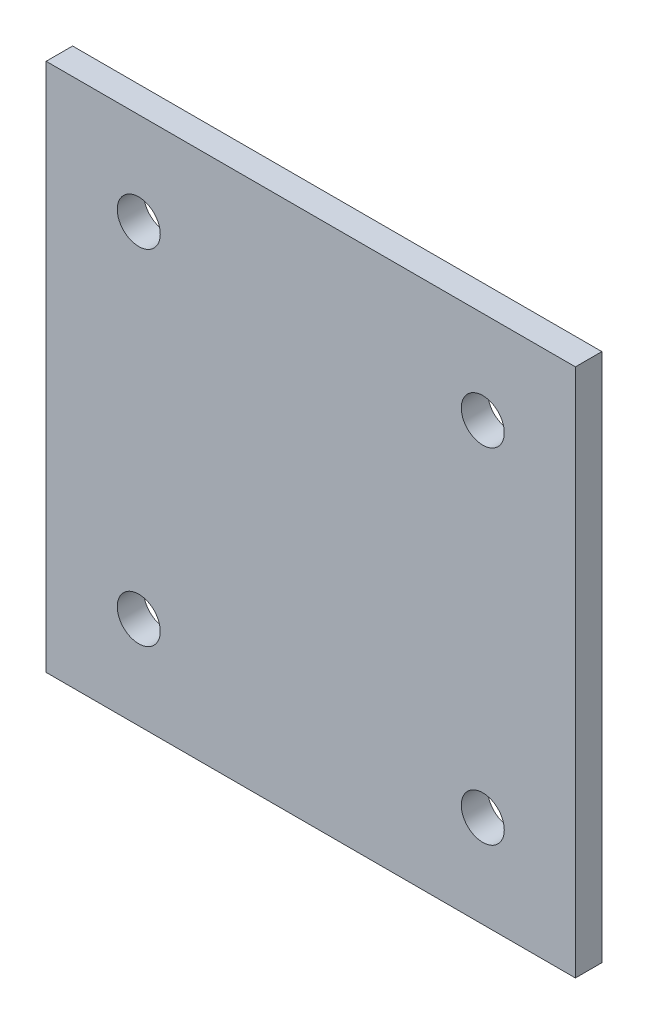
ISO-10303-21;
HEADER;
FILE_DESCRIPTION(('STEP AP214'),'2;1');
FILE_NAME('part.step','',(''),(''),'','','');
FILE_SCHEMA(('AUTOMOTIVE_DESIGN { 1 0 10303 214 1 1 1 1 }'));
ENDSEC;
DATA;
#1=APPLICATION_CONTEXT('core data for automotive mechanical design processes');
#2=APPLICATION_PROTOCOL_DEFINITION('international standard','automotive_design',2000,#1);
#3=PRODUCT_CONTEXT('',#1,'mechanical');
#4=PRODUCT('Part','Part','',(#3));
#5=PRODUCT_RELATED_PRODUCT_CATEGORY('part','',(#4));
#6=PRODUCT_DEFINITION_FORMATION('','',#4);
#7=PRODUCT_DEFINITION_CONTEXT('part definition',#1,'design');
#8=PRODUCT_DEFINITION('design','',#6,#7);
#9=PRODUCT_DEFINITION_SHAPE('','',#8);
#10=(LENGTH_UNIT() NAMED_UNIT(*) SI_UNIT(.MILLI.,.METRE.));
#11=(NAMED_UNIT(*) PLANE_ANGLE_UNIT() SI_UNIT($,.RADIAN.));
#12=(NAMED_UNIT(*) SI_UNIT($,.STERADIAN.) SOLID_ANGLE_UNIT());
#13=UNCERTAINTY_MEASURE_WITH_UNIT(LENGTH_MEASURE(1.E-05),#10,'distance_accuracy_value','');
#14=(GEOMETRIC_REPRESENTATION_CONTEXT(3) GLOBAL_UNCERTAINTY_ASSIGNED_CONTEXT((#13)) GLOBAL_UNIT_ASSIGNED_CONTEXT((#10,
#11,#12)) REPRESENTATION_CONTEXT('',''));
#15=CARTESIAN_POINT('',(0.,0.,0.));
#16=DIRECTION('',(0.,0.,1.));
#17=DIRECTION('',(1.,0.,0.));
#18=AXIS2_PLACEMENT_3D('',#15,#16,#17);
#19=CARTESIAN_POINT('',(0.,0.,2.));
#20=DIRECTION('',(0.,0.,-1.));
#21=DIRECTION('',(-1.,0.,0.));
#22=AXIS2_PLACEMENT_3D('',#19,#20,#21);
#23=PLANE('',#22);
#24=DIRECTION('',(0.,1.,0.));
#25=VECTOR('',#24,1.);
#26=CARTESIAN_POINT('',(20.,-20.,2.));
#27=LINE('',#26,#25);
#28=CARTESIAN_POINT('',(20.,-20.,2.));
#29=VERTEX_POINT('',#28);
#30=CARTESIAN_POINT('',(20.,20.,2.));
#31=VERTEX_POINT('',#30);
#32=EDGE_CURVE('E98',#29,#31,#27,.T.);
#33=ORIENTED_EDGE('',*,*,#32,.T.);
#34=DIRECTION('',(-1.,0.,0.));
#35=VECTOR('',#34,1.);
#36=CARTESIAN_POINT('',(-20.,20.,2.));
#37=LINE('',#36,#35);
#38=CARTESIAN_POINT('',(-20.,20.,2.));
#39=VERTEX_POINT('',#38);
#40=EDGE_CURVE('E93',#31,#39,#37,.T.);
#41=ORIENTED_EDGE('',*,*,#40,.T.);
#42=DIRECTION('',(0.,-1.,0.));
#43=VECTOR('',#42,1.);
#44=CARTESIAN_POINT('',(-20.,-20.,2.));
#45=LINE('',#44,#43);
#46=CARTESIAN_POINT('',(-20.,-20.,2.));
#47=VERTEX_POINT('',#46);
#48=EDGE_CURVE('E96',#39,#47,#45,.T.);
#49=ORIENTED_EDGE('',*,*,#48,.T.);
#50=DIRECTION('',(1.,0.,0.));
#51=VECTOR('',#50,1.);
#52=CARTESIAN_POINT('',(-20.,-20.,2.));
#53=LINE('',#52,#51);
#54=EDGE_CURVE('E63',#47,#29,#53,.T.);
#55=ORIENTED_EDGE('',*,*,#54,.T.);
#56=EDGE_LOOP('',(#33,#41,#49,#55));
#57=FACE_BOUND('',#56,.T.);
#58=CARTESIAN_POINT('',(-13.,13.,2.));
#59=DIRECTION('',(0.,0.,1.));
#60=DIRECTION('',(1.,0.,0.));
#61=AXIS2_PLACEMENT_3D('',#58,#59,#60);
#62=CIRCLE('',#61,1.625);
#63=CARTESIAN_POINT('',(-11.375,13.,2.));
#64=VERTEX_POINT('',#63);
#65=EDGE_CURVE('E118',#64,#64,#62,.T.);
#66=ORIENTED_EDGE('',*,*,#65,.F.);
#67=EDGE_LOOP('',(#66));
#68=FACE_BOUND('',#67,.T.);
#69=CARTESIAN_POINT('',(-13.,-13.,2.));
#70=DIRECTION('',(0.,0.,1.));
#71=DIRECTION('',(-1.,0.,0.));
#72=AXIS2_PLACEMENT_3D('',#69,#70,#71);
#73=CIRCLE('',#72,1.625);
#74=CARTESIAN_POINT('',(-14.625,-13.,2.));
#75=VERTEX_POINT('',#74);
#76=EDGE_CURVE('E140',#75,#75,#73,.T.);
#77=ORIENTED_EDGE('',*,*,#76,.F.);
#78=EDGE_LOOP('',(#77));
#79=FACE_BOUND('',#78,.T.);
#80=CARTESIAN_POINT('',(13.,-13.,2.));
#81=DIRECTION('',(0.,0.,1.));
#82=DIRECTION('',(1.,0.,0.));
#83=AXIS2_PLACEMENT_3D('',#80,#81,#82);
#84=CIRCLE('',#83,1.625);
#85=CARTESIAN_POINT('',(14.625,-13.,2.));
#86=VERTEX_POINT('',#85);
#87=EDGE_CURVE('E148',#86,#86,#84,.T.);
#88=ORIENTED_EDGE('',*,*,#87,.F.);
#89=EDGE_LOOP('',(#88));
#90=FACE_BOUND('',#89,.T.);
#91=CARTESIAN_POINT('',(13.,13.,2.));
#92=DIRECTION('',(0.,0.,1.));
#93=DIRECTION('',(-1.,0.,0.));
#94=AXIS2_PLACEMENT_3D('',#91,#92,#93);
#95=CIRCLE('',#94,1.625);
#96=CARTESIAN_POINT('',(11.375,13.,2.));
#97=VERTEX_POINT('',#96);
#98=EDGE_CURVE('E156',#97,#97,#95,.T.);
#99=ORIENTED_EDGE('',*,*,#98,.F.);
#100=EDGE_LOOP('',(#99));
#101=FACE_BOUND('',#100,.T.);
#102=ADVANCED_FACE('F45',(#57,#68,#79,#90,#101),#23,.F.);
#103=CARTESIAN_POINT('',(0.,0.,0.));
#104=DIRECTION('',(0.,0.,-1.));
#105=DIRECTION('',(-1.,0.,0.));
#106=AXIS2_PLACEMENT_3D('',#103,#104,#105);
#107=PLANE('',#106);
#108=CARTESIAN_POINT('',(13.,-13.,0.));
#109=DIRECTION('',(0.,0.,1.));
#110=DIRECTION('',(1.,0.,0.));
#111=AXIS2_PLACEMENT_3D('',#108,#109,#110);
#112=CIRCLE('',#111,1.625);
#113=CARTESIAN_POINT('',(14.625,-13.,0.));
#114=VERTEX_POINT('',#113);
#115=EDGE_CURVE('E152',#114,#114,#112,.T.);
#116=ORIENTED_EDGE('',*,*,#115,.T.);
#117=EDGE_LOOP('',(#116));
#118=FACE_BOUND('',#117,.T.);
#119=CARTESIAN_POINT('',(-13.,13.,0.));
#120=DIRECTION('',(0.,0.,1.));
#121=DIRECTION('',(1.,0.,0.));
#122=AXIS2_PLACEMENT_3D('',#119,#120,#121);
#123=CIRCLE('',#122,1.625);
#124=CARTESIAN_POINT('',(-11.375,13.,0.));
#125=VERTEX_POINT('',#124);
#126=EDGE_CURVE('E136',#125,#125,#123,.T.);
#127=ORIENTED_EDGE('',*,*,#126,.T.);
#128=EDGE_LOOP('',(#127));
#129=FACE_BOUND('',#128,.T.);
#130=DIRECTION('',(0.,1.,0.));
#131=VECTOR('',#130,1.);
#132=CARTESIAN_POINT('',(20.,-20.,0.));
#133=LINE('',#132,#131);
#134=CARTESIAN_POINT('',(20.,-20.,0.));
#135=VERTEX_POINT('',#134);
#136=CARTESIAN_POINT('',(20.,20.,0.));
#137=VERTEX_POINT('',#136);
#138=EDGE_CURVE('E114',#135,#137,#133,.T.);
#139=ORIENTED_EDGE('',*,*,#138,.F.);
#140=DIRECTION('',(1.,0.,0.));
#141=VECTOR('',#140,1.);
#142=CARTESIAN_POINT('',(-20.,-20.,0.));
#143=LINE('',#142,#141);
#144=CARTESIAN_POINT('',(-20.,-20.,0.));
#145=VERTEX_POINT('',#144);
#146=EDGE_CURVE('E86',#145,#135,#143,.T.);
#147=ORIENTED_EDGE('',*,*,#146,.F.);
#148=DIRECTION('',(0.,-1.,0.));
#149=VECTOR('',#148,1.);
#150=CARTESIAN_POINT('',(-20.,-20.,0.));
#151=LINE('',#150,#149);
#152=CARTESIAN_POINT('',(-20.,20.,0.));
#153=VERTEX_POINT('',#152);
#154=EDGE_CURVE('E80',#153,#145,#151,.T.);
#155=ORIENTED_EDGE('',*,*,#154,.F.);
#156=DIRECTION('',(-1.,0.,0.));
#157=VECTOR('',#156,1.);
#158=CARTESIAN_POINT('',(-20.,20.,0.));
#159=LINE('',#158,#157);
#160=EDGE_CURVE('E103',#137,#153,#159,.T.);
#161=ORIENTED_EDGE('',*,*,#160,.F.);
#162=EDGE_LOOP('',(#139,#147,#155,#161));
#163=FACE_BOUND('',#162,.T.);
#164=CARTESIAN_POINT('',(-13.,-13.,0.));
#165=DIRECTION('',(0.,0.,1.));
#166=DIRECTION('',(-1.,0.,0.));
#167=AXIS2_PLACEMENT_3D('',#164,#165,#166);
#168=CIRCLE('',#167,1.625);
#169=CARTESIAN_POINT('',(-14.625,-13.,0.));
#170=VERTEX_POINT('',#169);
#171=EDGE_CURVE('E144',#170,#170,#168,.T.);
#172=ORIENTED_EDGE('',*,*,#171,.T.);
#173=EDGE_LOOP('',(#172));
#174=FACE_BOUND('',#173,.T.);
#175=CARTESIAN_POINT('',(13.,13.,0.));
#176=DIRECTION('',(0.,0.,1.));
#177=DIRECTION('',(-1.,0.,0.));
#178=AXIS2_PLACEMENT_3D('',#175,#176,#177);
#179=CIRCLE('',#178,1.625);
#180=CARTESIAN_POINT('',(11.375,13.,0.));
#181=VERTEX_POINT('',#180);
#182=EDGE_CURVE('E160',#181,#181,#179,.T.);
#183=ORIENTED_EDGE('',*,*,#182,.T.);
#184=EDGE_LOOP('',(#183));
#185=FACE_BOUND('',#184,.T.);
#186=ADVANCED_FACE('F131',(#118,#129,#163,#174,#185),#107,.T.);
#187=CARTESIAN_POINT('',(20.,-20.,2.));
#188=DIRECTION('',(-1.,0.,0.));
#189=DIRECTION('',(0.,0.,1.));
#190=AXIS2_PLACEMENT_3D('',#187,#188,#189);
#191=PLANE('',#190);
#192=ORIENTED_EDGE('',*,*,#138,.T.);
#193=DIRECTION('',(0.,0.,-1.));
#194=VECTOR('',#193,1.);
#195=CARTESIAN_POINT('',(20.,20.,2.));
#196=LINE('',#195,#194);
#197=EDGE_CURVE('E11',#31,#137,#196,.T.);
#198=ORIENTED_EDGE('',*,*,#197,.F.);
#199=ORIENTED_EDGE('',*,*,#32,.F.);
#200=DIRECTION('',(0.,0.,-1.));
#201=VECTOR('',#200,1.);
#202=CARTESIAN_POINT('',(20.,-20.,2.));
#203=LINE('',#202,#201);
#204=EDGE_CURVE('E110',#29,#135,#203,.T.);
#205=ORIENTED_EDGE('',*,*,#204,.T.);
#206=EDGE_LOOP('',(#192,#198,#199,#205));
#207=FACE_BOUND('',#206,.T.);
#208=ADVANCED_FACE('F47',(#207),#191,.F.);
#209=CARTESIAN_POINT('',(-20.,20.,2.));
#210=DIRECTION('',(0.,-1.,0.));
#211=DIRECTION('',(0.,0.,-1.));
#212=AXIS2_PLACEMENT_3D('',#209,#210,#211);
#213=PLANE('',#212);
#214=ORIENTED_EDGE('',*,*,#160,.T.);
#215=DIRECTION('',(0.,0.,-1.));
#216=VECTOR('',#215,1.);
#217=CARTESIAN_POINT('',(-20.,20.,2.));
#218=LINE('',#217,#216);
#219=EDGE_CURVE('E55',#39,#153,#218,.T.);
#220=ORIENTED_EDGE('',*,*,#219,.F.);
#221=ORIENTED_EDGE('',*,*,#40,.F.);
#222=ORIENTED_EDGE('',*,*,#197,.T.);
#223=EDGE_LOOP('',(#214,#220,#221,#222));
#224=FACE_BOUND('',#223,.T.);
#225=ADVANCED_FACE('F102',(#224),#213,.F.);
#226=CARTESIAN_POINT('',(-20.,-20.,2.));
#227=DIRECTION('',(1.,0.,0.));
#228=DIRECTION('',(0.,0.,-1.));
#229=AXIS2_PLACEMENT_3D('',#226,#227,#228);
#230=PLANE('',#229);
#231=ORIENTED_EDGE('',*,*,#154,.T.);
#232=DIRECTION('',(0.,0.,-1.));
#233=VECTOR('',#232,1.);
#234=CARTESIAN_POINT('',(-20.,-20.,2.));
#235=LINE('',#234,#233);
#236=EDGE_CURVE('E105',#47,#145,#235,.T.);
#237=ORIENTED_EDGE('',*,*,#236,.F.);
#238=ORIENTED_EDGE('',*,*,#48,.F.);
#239=ORIENTED_EDGE('',*,*,#219,.T.);
#240=EDGE_LOOP('',(#231,#237,#238,#239));
#241=FACE_BOUND('',#240,.T.);
#242=ADVANCED_FACE('F106',(#241),#230,.F.);
#243=CARTESIAN_POINT('',(-20.,-20.,2.));
#244=DIRECTION('',(0.,1.,0.));
#245=DIRECTION('',(0.,0.,1.));
#246=AXIS2_PLACEMENT_3D('',#243,#244,#245);
#247=PLANE('',#246);
#248=ORIENTED_EDGE('',*,*,#146,.T.);
#249=ORIENTED_EDGE('',*,*,#204,.F.);
#250=ORIENTED_EDGE('',*,*,#54,.F.);
#251=ORIENTED_EDGE('',*,*,#236,.T.);
#252=EDGE_LOOP('',(#248,#249,#250,#251));
#253=FACE_BOUND('',#252,.T.);
#254=ADVANCED_FACE('F128',(#253),#247,.F.);
#255=CARTESIAN_POINT('',(-13.,13.,2.));
#256=DIRECTION('',(0.,0.,-1.));
#257=DIRECTION('',(-1.,0.,0.));
#258=AXIS2_PLACEMENT_3D('',#255,#256,#257);
#259=CYLINDRICAL_SURFACE('',#258,1.625);
#260=ORIENTED_EDGE('',*,*,#65,.T.);
#261=EDGE_LOOP('',(#260));
#262=FACE_BOUND('',#261,.T.);
#263=ORIENTED_EDGE('',*,*,#126,.F.);
#264=EDGE_LOOP('',(#263));
#265=FACE_BOUND('',#264,.T.);
#266=ADVANCED_FACE('F179',(#262,#265),#259,.F.);
#267=CARTESIAN_POINT('',(-13.,-13.,2.));
#268=DIRECTION('',(0.,0.,-1.));
#269=DIRECTION('',(-1.,0.,0.));
#270=AXIS2_PLACEMENT_3D('',#267,#268,#269);
#271=CYLINDRICAL_SURFACE('',#270,1.625);
#272=ORIENTED_EDGE('',*,*,#76,.T.);
#273=EDGE_LOOP('',(#272));
#274=FACE_BOUND('',#273,.T.);
#275=ORIENTED_EDGE('',*,*,#171,.F.);
#276=EDGE_LOOP('',(#275));
#277=FACE_BOUND('',#276,.T.);
#278=ADVANCED_FACE('F224',(#274,#277),#271,.F.);
#279=CARTESIAN_POINT('',(13.,-13.,2.));
#280=DIRECTION('',(0.,0.,-1.));
#281=DIRECTION('',(-1.,0.,0.));
#282=AXIS2_PLACEMENT_3D('',#279,#280,#281);
#283=CYLINDRICAL_SURFACE('',#282,1.625);
#284=ORIENTED_EDGE('',*,*,#87,.T.);
#285=EDGE_LOOP('',(#284));
#286=FACE_BOUND('',#285,.T.);
#287=ORIENTED_EDGE('',*,*,#115,.F.);
#288=EDGE_LOOP('',(#287));
#289=FACE_BOUND('',#288,.T.);
#290=ADVANCED_FACE('F232',(#286,#289),#283,.F.);
#291=CARTESIAN_POINT('',(13.,13.,2.));
#292=DIRECTION('',(0.,0.,-1.));
#293=DIRECTION('',(-1.,0.,0.));
#294=AXIS2_PLACEMENT_3D('',#291,#292,#293);
#295=CYLINDRICAL_SURFACE('',#294,1.625);
#296=ORIENTED_EDGE('',*,*,#98,.T.);
#297=EDGE_LOOP('',(#296));
#298=FACE_BOUND('',#297,.T.);
#299=ORIENTED_EDGE('',*,*,#182,.F.);
#300=EDGE_LOOP('',(#299));
#301=FACE_BOUND('',#300,.T.);
#302=ADVANCED_FACE('F168',(#298,#301),#295,.F.);
#303=CLOSED_SHELL('',(#102,#186,#208,#225,#242,#254,#266,#278,#290,#302));
#304=MANIFOLD_SOLID_BREP('B2',#303);
#305=ADVANCED_BREP_SHAPE_REPRESENTATION('',(#18,#304),#14);
#306=SHAPE_DEFINITION_REPRESENTATION(#9,#305);
ENDSEC;
END-ISO-10303-21;
